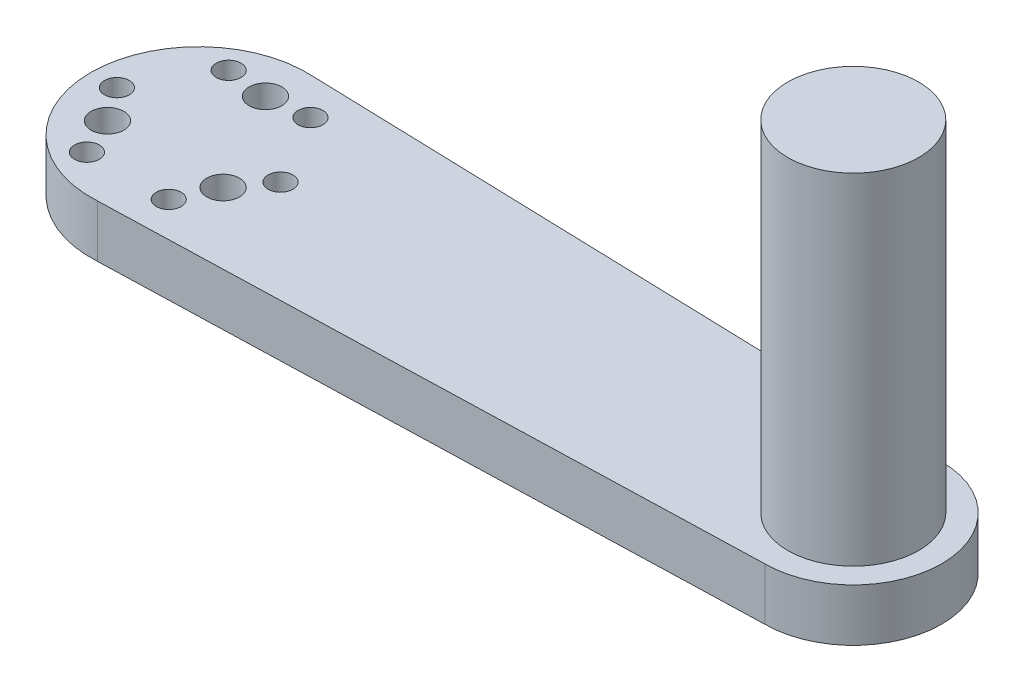
ISO-10303-21;
HEADER;
FILE_DESCRIPTION(('STEP AP214'),'2;1');
FILE_NAME('part.step','',(''),(''),'','','');
FILE_SCHEMA(('AUTOMOTIVE_DESIGN { 1 0 10303 214 1 1 1 1 }'));
ENDSEC;
DATA;
#1=APPLICATION_CONTEXT('core data for automotive mechanical design processes');
#2=APPLICATION_PROTOCOL_DEFINITION('international standard','automotive_design',2000,#1);
#3=PRODUCT_CONTEXT('',#1,'mechanical');
#4=PRODUCT('Part','Part','',(#3));
#5=PRODUCT_RELATED_PRODUCT_CATEGORY('part','',(#4));
#6=PRODUCT_DEFINITION_FORMATION('','',#4);
#7=PRODUCT_DEFINITION_CONTEXT('part definition',#1,'design');
#8=PRODUCT_DEFINITION('design','',#6,#7);
#9=PRODUCT_DEFINITION_SHAPE('','',#8);
#10=(LENGTH_UNIT() NAMED_UNIT(*) SI_UNIT(.MILLI.,.METRE.));
#11=(NAMED_UNIT(*) PLANE_ANGLE_UNIT() SI_UNIT($,.RADIAN.));
#12=(NAMED_UNIT(*) SI_UNIT($,.STERADIAN.) SOLID_ANGLE_UNIT());
#13=UNCERTAINTY_MEASURE_WITH_UNIT(LENGTH_MEASURE(1.E-05),#10,'distance_accuracy_value','');
#14=(GEOMETRIC_REPRESENTATION_CONTEXT(3) GLOBAL_UNCERTAINTY_ASSIGNED_CONTEXT((#13)) GLOBAL_UNIT_ASSIGNED_CONTEXT((#10,
#11,#12)) REPRESENTATION_CONTEXT('',''));
#15=CARTESIAN_POINT('',(0.,0.,0.));
#16=DIRECTION('',(0.,0.,1.));
#17=DIRECTION('',(1.,0.,0.));
#18=AXIS2_PLACEMENT_3D('',#15,#16,#17);
#19=CARTESIAN_POINT('',(0.,8.,0.));
#20=DIRECTION('',(0.,-1.,0.));
#21=DIRECTION('',(0.,0.,-1.));
#22=AXIS2_PLACEMENT_3D('',#19,#20,#21);
#23=CYLINDRICAL_SURFACE('',#22,16.5);
#24=CARTESIAN_POINT('',(0.,0.,0.));
#25=DIRECTION('',(0.,1.,0.));
#26=DIRECTION('',(0.,0.,1.));
#27=AXIS2_PLACEMENT_3D('',#24,#25,#26);
#28=CIRCLE('',#27,16.5);
#29=CARTESIAN_POINT('',(0.98910980117891,0.,-16.4703267059646));
#30=VERTEX_POINT('',#29);
#31=CARTESIAN_POINT('',(0.989109801178909,0.,16.4703267059646));
#32=VERTEX_POINT('',#31);
#33=EDGE_CURVE('E46',#30,#32,#28,.T.);
#34=ORIENTED_EDGE('',*,*,#33,.T.);
#35=DIRECTION('',(0.,-1.,0.));
#36=VECTOR('',#35,1.);
#37=CARTESIAN_POINT('',(0.98910980117891,8.,16.4703267059646));
#38=LINE('',#37,#36);
#39=CARTESIAN_POINT('',(0.989109801178909,8.,16.4703267059646));
#40=VERTEX_POINT('',#39);
#41=EDGE_CURVE('E60',#40,#32,#38,.T.);
#42=ORIENTED_EDGE('',*,*,#41,.F.);
#43=CARTESIAN_POINT('',(0.,8.,0.));
#44=DIRECTION('',(0.,1.,0.));
#45=DIRECTION('',(0.,0.,1.));
#46=AXIS2_PLACEMENT_3D('',#43,#44,#45);
#47=CIRCLE('',#46,16.5);
#48=CARTESIAN_POINT('',(0.989109801178909,8.,-16.4703267059646));
#49=VERTEX_POINT('',#48);
#50=EDGE_CURVE('E11',#49,#40,#47,.T.);
#51=ORIENTED_EDGE('',*,*,#50,.F.);
#52=DIRECTION('',(0.,-1.,0.));
#53=VECTOR('',#52,1.);
#54=CARTESIAN_POINT('',(0.98910980117891,8.,-16.4703267059646));
#55=LINE('',#54,#53);
#56=EDGE_CURVE('E117',#49,#30,#55,.T.);
#57=ORIENTED_EDGE('',*,*,#56,.T.);
#58=EDGE_LOOP('',(#34,#42,#51,#57));
#59=FACE_BOUND('',#58,.T.);
#60=ADVANCED_FACE('F43',(#59),#23,.T.);
#61=CARTESIAN_POINT('',(0.,8.,0.));
#62=DIRECTION('',(0.,1.,0.));
#63=DIRECTION('',(0.,0.,1.));
#64=AXIS2_PLACEMENT_3D('',#61,#62,#63);
#65=PLANE('',#64);
#66=CARTESIAN_POINT('',(6.25000000000001,8.,-10.8253175473055));
#67=DIRECTION('',(0.,1.,0.));
#68=DIRECTION('',(0.,0.,1.));
#69=AXIS2_PLACEMENT_3D('',#66,#67,#68);
#70=CIRCLE('',#69,1.9);
#71=CARTESIAN_POINT('',(6.25000000000001,8.,-8.92531754730548));
#72=VERTEX_POINT('',#71);
#73=EDGE_CURVE('E170',#72,#72,#70,.T.);
#74=ORIENTED_EDGE('',*,*,#73,.F.);
#75=EDGE_LOOP('',(#74));
#76=FACE_BOUND('',#75,.T.);
#77=CARTESIAN_POINT('',(12.5,8.,0.));
#78=DIRECTION('',(0.,1.,0.));
#79=DIRECTION('',(0.,0.,1.));
#80=AXIS2_PLACEMENT_3D('',#77,#78,#79);
#81=CIRCLE('',#80,1.9);
#82=CARTESIAN_POINT('',(12.5,8.,1.90000000000004));
#83=VERTEX_POINT('',#82);
#84=EDGE_CURVE('E167',#83,#83,#81,.T.);
#85=ORIENTED_EDGE('',*,*,#84,.F.);
#86=EDGE_LOOP('',(#85));
#87=FACE_BOUND('',#86,.T.);
#88=CARTESIAN_POINT('',(8.83345911860192,8.,5.09999999999962));
#89=DIRECTION('',(0.,1.,0.));
#90=DIRECTION('',(0.,0.,1.));
#91=AXIS2_PLACEMENT_3D('',#88,#89,#90);
#92=CIRCLE('',#91,2.5);
#93=CARTESIAN_POINT('',(8.83345911860192,8.,7.59999999999962));
#94=VERTEX_POINT('',#93);
#95=EDGE_CURVE('E164',#94,#94,#92,.T.);
#96=ORIENTED_EDGE('',*,*,#95,.F.);
#97=EDGE_LOOP('',(#96));
#98=FACE_BOUND('',#97,.T.);
#99=CARTESIAN_POINT('',(6.24999999999994,8.,10.8253175473055));
#100=DIRECTION('',(0.,1.,0.));
#101=DIRECTION('',(0.,0.,1.));
#102=AXIS2_PLACEMENT_3D('',#99,#100,#101);
#103=CIRCLE('',#102,1.9);
#104=CARTESIAN_POINT('',(6.24999999999994,8.,12.7253175473055));
#105=VERTEX_POINT('',#104);
#106=EDGE_CURVE('E161',#105,#105,#103,.T.);
#107=ORIENTED_EDGE('',*,*,#106,.F.);
#108=EDGE_LOOP('',(#107));
#109=FACE_BOUND('',#108,.T.);
#110=CARTESIAN_POINT('',(-6.25000000000009,8.,10.8253175473054));
#111=DIRECTION('',(0.,1.,0.));
#112=DIRECTION('',(0.,0.,1.));
#113=AXIS2_PLACEMENT_3D('',#110,#111,#112);
#114=CIRCLE('',#113,1.9);
#115=CARTESIAN_POINT('',(-6.25000000000009,8.,12.7253175473054));
#116=VERTEX_POINT('',#115);
#117=EDGE_CURVE('E158',#116,#116,#114,.T.);
#118=ORIENTED_EDGE('',*,*,#117,.F.);
#119=EDGE_LOOP('',(#118));
#120=FACE_BOUND('',#119,.T.);
#121=CARTESIAN_POINT('',(-8.83345911860063,8.,5.10000000000037));
#122=DIRECTION('',(0.,1.,0.));
#123=DIRECTION('',(0.,0.,1.));
#124=AXIS2_PLACEMENT_3D('',#121,#122,#123);
#125=CIRCLE('',#124,2.5);
#126=CARTESIAN_POINT('',(-8.83345911860063,8.,7.60000000000037));
#127=VERTEX_POINT('',#126);
#128=EDGE_CURVE('E155',#127,#127,#125,.T.);
#129=ORIENTED_EDGE('',*,*,#128,.F.);
#130=EDGE_LOOP('',(#129));
#131=FACE_BOUND('',#130,.T.);
#132=CARTESIAN_POINT('',(0.,8.,-10.2));
#133=DIRECTION('',(0.,1.,0.));
#134=DIRECTION('',(0.,0.,1.));
#135=AXIS2_PLACEMENT_3D('',#132,#133,#134);
#136=CIRCLE('',#135,2.5);
#137=CARTESIAN_POINT('',(0.,8.,-7.7));
#138=VERTEX_POINT('',#137);
#139=EDGE_CURVE('E152',#138,#138,#136,.T.);
#140=ORIENTED_EDGE('',*,*,#139,.F.);
#141=EDGE_LOOP('',(#140));
#142=FACE_BOUND('',#141,.T.);
#143=CARTESIAN_POINT('',(-6.25000000000002,8.,-10.8253175473055));
#144=DIRECTION('',(0.,1.,0.));
#145=DIRECTION('',(0.,0.,1.));
#146=AXIS2_PLACEMENT_3D('',#143,#144,#145);
#147=CIRCLE('',#146,1.9);
#148=CARTESIAN_POINT('',(-6.25000000000002,8.,-8.92531754730548));
#149=VERTEX_POINT('',#148);
#150=EDGE_CURVE('E149',#149,#149,#147,.T.);
#151=ORIENTED_EDGE('',*,*,#150,.F.);
#152=EDGE_LOOP('',(#151));
#153=FACE_BOUND('',#152,.T.);
#154=CARTESIAN_POINT('',(-12.5,8.,-1.27502175484295E-13));
#155=DIRECTION('',(0.,1.,0.));
#156=DIRECTION('',(0.,0.,1.));
#157=AXIS2_PLACEMENT_3D('',#154,#155,#156);
#158=CIRCLE('',#157,1.9);
#159=CARTESIAN_POINT('',(-12.5,8.,1.89999999999987));
#160=VERTEX_POINT('',#159);
#161=EDGE_CURVE('E146',#160,#160,#158,.T.);
#162=ORIENTED_EDGE('',*,*,#161,.F.);
#163=EDGE_LOOP('',(#162));
#164=FACE_BOUND('',#163,.T.);
#165=ORIENTED_EDGE('',*,*,#50,.T.);
#166=DIRECTION('',(-0.999550303522367,0.,0.029986509105671));
#167=VECTOR('',#166,1.);
#168=CARTESIAN_POINT('',(0.49455490058947,8.,16.4851633529823));
#169=LINE('',#168,#167);
#170=CARTESIAN_POINT('',(100.,8.,13.5));
#171=VERTEX_POINT('',#170);
#172=EDGE_CURVE('E84',#171,#40,#169,.T.);
#173=ORIENTED_EDGE('',*,*,#172,.F.);
#174=CARTESIAN_POINT('',(100.,8.,0.));
#175=DIRECTION('',(0.,1.,0.));
#176=DIRECTION('',(0.,0.,1.));
#177=AXIS2_PLACEMENT_3D('',#174,#175,#176);
#178=CIRCLE('',#177,13.5);
#179=CARTESIAN_POINT('',(100.,8.,-13.5));
#180=VERTEX_POINT('',#179);
#181=EDGE_CURVE('E93',#171,#180,#178,.T.);
#182=ORIENTED_EDGE('',*,*,#181,.T.);
#183=DIRECTION('',(-0.999550303522367,0.,-0.029986509105671));
#184=VECTOR('',#183,1.);
#185=CARTESIAN_POINT('',(0.49455490058947,8.,-16.4851633529823));
#186=LINE('',#185,#184);
#187=EDGE_CURVE('E98',#180,#49,#186,.T.);
#188=ORIENTED_EDGE('',*,*,#187,.T.);
#189=EDGE_LOOP('',(#165,#173,#182,#188));
#190=FACE_BOUND('',#189,.T.);
#191=CARTESIAN_POINT('',(100.,8.,0.));
#192=DIRECTION('',(0.,1.,0.));
#193=DIRECTION('',(0.,0.,1.));
#194=AXIS2_PLACEMENT_3D('',#191,#192,#193);
#195=CIRCLE('',#194,10.);
#196=CARTESIAN_POINT('',(100.,8.,10.));
#197=VERTEX_POINT('',#196);
#198=EDGE_CURVE('E111',#197,#197,#195,.T.);
#199=ORIENTED_EDGE('',*,*,#198,.F.);
#200=EDGE_LOOP('',(#199));
#201=FACE_BOUND('',#200,.T.);
#202=ADVANCED_FACE('F100',(#76,#87,#98,#109,#120,#131,#142,#153,#164,#190,#201),#65,.T.);
#203=CARTESIAN_POINT('',(0.,0.,0.));
#204=DIRECTION('',(0.,1.,0.));
#205=DIRECTION('',(0.,0.,1.));
#206=AXIS2_PLACEMENT_3D('',#203,#204,#205);
#207=PLANE('',#206);
#208=CARTESIAN_POINT('',(6.25000000000001,0.,-10.8253175473055));
#209=DIRECTION('',(0.,1.,0.));
#210=DIRECTION('',(0.,0.,1.));
#211=AXIS2_PLACEMENT_3D('',#208,#209,#210);
#212=CIRCLE('',#211,1.9);
#213=CARTESIAN_POINT('',(6.25000000000001,0.,-8.92531754730548));
#214=VERTEX_POINT('',#213);
#215=EDGE_CURVE('E89',#214,#214,#212,.T.);
#216=ORIENTED_EDGE('',*,*,#215,.T.);
#217=EDGE_LOOP('',(#216));
#218=FACE_BOUND('',#217,.T.);
#219=CARTESIAN_POINT('',(12.5,0.,0.));
#220=DIRECTION('',(0.,1.,0.));
#221=DIRECTION('',(0.,0.,1.));
#222=AXIS2_PLACEMENT_3D('',#219,#220,#221);
#223=CIRCLE('',#222,1.9);
#224=CARTESIAN_POINT('',(12.5,0.,1.90000000000004));
#225=VERTEX_POINT('',#224);
#226=EDGE_CURVE('E139',#225,#225,#223,.T.);
#227=ORIENTED_EDGE('',*,*,#226,.T.);
#228=EDGE_LOOP('',(#227));
#229=FACE_BOUND('',#228,.T.);
#230=CARTESIAN_POINT('',(8.83345911860192,0.,5.09999999999962));
#231=DIRECTION('',(0.,1.,0.));
#232=DIRECTION('',(0.,0.,1.));
#233=AXIS2_PLACEMENT_3D('',#230,#231,#232);
#234=CIRCLE('',#233,2.5);
#235=CARTESIAN_POINT('',(8.83345911860192,0.,7.59999999999962));
#236=VERTEX_POINT('',#235);
#237=EDGE_CURVE('E136',#236,#236,#234,.T.);
#238=ORIENTED_EDGE('',*,*,#237,.T.);
#239=EDGE_LOOP('',(#238));
#240=FACE_BOUND('',#239,.T.);
#241=CARTESIAN_POINT('',(6.24999999999994,0.,10.8253175473055));
#242=DIRECTION('',(0.,1.,0.));
#243=DIRECTION('',(0.,0.,1.));
#244=AXIS2_PLACEMENT_3D('',#241,#242,#243);
#245=CIRCLE('',#244,1.9);
#246=CARTESIAN_POINT('',(6.24999999999994,0.,12.7253175473055));
#247=VERTEX_POINT('',#246);
#248=EDGE_CURVE('E133',#247,#247,#245,.T.);
#249=ORIENTED_EDGE('',*,*,#248,.T.);
#250=EDGE_LOOP('',(#249));
#251=FACE_BOUND('',#250,.T.);
#252=CARTESIAN_POINT('',(-6.25000000000009,0.,10.8253175473054));
#253=DIRECTION('',(0.,1.,0.));
#254=DIRECTION('',(0.,0.,1.));
#255=AXIS2_PLACEMENT_3D('',#252,#253,#254);
#256=CIRCLE('',#255,1.9);
#257=CARTESIAN_POINT('',(-6.25000000000009,0.,12.7253175473054));
#258=VERTEX_POINT('',#257);
#259=EDGE_CURVE('E130',#258,#258,#256,.T.);
#260=ORIENTED_EDGE('',*,*,#259,.T.);
#261=EDGE_LOOP('',(#260));
#262=FACE_BOUND('',#261,.T.);
#263=CARTESIAN_POINT('',(-8.83345911860063,0.,5.10000000000037));
#264=DIRECTION('',(0.,1.,0.));
#265=DIRECTION('',(0.,0.,1.));
#266=AXIS2_PLACEMENT_3D('',#263,#264,#265);
#267=CIRCLE('',#266,2.5);
#268=CARTESIAN_POINT('',(-8.83345911860063,0.,7.60000000000037));
#269=VERTEX_POINT('',#268);
#270=EDGE_CURVE('E127',#269,#269,#267,.T.);
#271=ORIENTED_EDGE('',*,*,#270,.T.);
#272=EDGE_LOOP('',(#271));
#273=FACE_BOUND('',#272,.T.);
#274=CARTESIAN_POINT('',(0.,0.,-10.2));
#275=DIRECTION('',(0.,1.,0.));
#276=DIRECTION('',(0.,0.,1.));
#277=AXIS2_PLACEMENT_3D('',#274,#275,#276);
#278=CIRCLE('',#277,2.5);
#279=CARTESIAN_POINT('',(0.,0.,-7.7));
#280=VERTEX_POINT('',#279);
#281=EDGE_CURVE('E124',#280,#280,#278,.T.);
#282=ORIENTED_EDGE('',*,*,#281,.T.);
#283=EDGE_LOOP('',(#282));
#284=FACE_BOUND('',#283,.T.);
#285=CARTESIAN_POINT('',(-6.25000000000002,0.,-10.8253175473055));
#286=DIRECTION('',(0.,1.,0.));
#287=DIRECTION('',(0.,0.,1.));
#288=AXIS2_PLACEMENT_3D('',#285,#286,#287);
#289=CIRCLE('',#288,1.9);
#290=CARTESIAN_POINT('',(-6.25000000000002,0.,-8.92531754730548));
#291=VERTEX_POINT('',#290);
#292=EDGE_CURVE('E120',#291,#291,#289,.T.);
#293=ORIENTED_EDGE('',*,*,#292,.T.);
#294=EDGE_LOOP('',(#293));
#295=FACE_BOUND('',#294,.T.);
#296=CARTESIAN_POINT('',(-12.5,0.,-1.27502175484295E-13));
#297=DIRECTION('',(0.,1.,0.));
#298=DIRECTION('',(0.,0.,1.));
#299=AXIS2_PLACEMENT_3D('',#296,#297,#298);
#300=CIRCLE('',#299,1.9);
#301=CARTESIAN_POINT('',(-12.5,0.,1.89999999999987));
#302=VERTEX_POINT('',#301);
#303=EDGE_CURVE('E123',#302,#302,#300,.T.);
#304=ORIENTED_EDGE('',*,*,#303,.T.);
#305=EDGE_LOOP('',(#304));
#306=FACE_BOUND('',#305,.T.);
#307=ORIENTED_EDGE('',*,*,#33,.F.);
#308=DIRECTION('',(-0.999550303522367,0.,-0.029986509105671));
#309=VECTOR('',#308,1.);
#310=CARTESIAN_POINT('',(0.49455490058947,0.,-16.4851633529823));
#311=LINE('',#310,#309);
#312=CARTESIAN_POINT('',(100.,0.,-13.5));
#313=VERTEX_POINT('',#312);
#314=EDGE_CURVE('E102',#313,#30,#311,.T.);
#315=ORIENTED_EDGE('',*,*,#314,.F.);
#316=CARTESIAN_POINT('',(100.,0.,0.));
#317=DIRECTION('',(0.,1.,0.));
#318=DIRECTION('',(0.,0.,1.));
#319=AXIS2_PLACEMENT_3D('',#316,#317,#318);
#320=CIRCLE('',#319,13.5);
#321=CARTESIAN_POINT('',(100.,0.,13.5));
#322=VERTEX_POINT('',#321);
#323=EDGE_CURVE('E105',#322,#313,#320,.T.);
#324=ORIENTED_EDGE('',*,*,#323,.F.);
#325=DIRECTION('',(-0.999550303522367,0.,0.029986509105671));
#326=VECTOR('',#325,1.);
#327=CARTESIAN_POINT('',(0.49455490058947,0.,16.4851633529823));
#328=LINE('',#327,#326);
#329=EDGE_CURVE('E86',#322,#32,#328,.T.);
#330=ORIENTED_EDGE('',*,*,#329,.T.);
#331=EDGE_LOOP('',(#307,#315,#324,#330));
#332=FACE_BOUND('',#331,.T.);
#333=ADVANCED_FACE('F177',(#218,#229,#240,#251,#262,#273,#284,#295,#306,#332),#207,.F.);
#334=CARTESIAN_POINT('',(-12.5,0.,-1.27502175484295E-13));
#335=DIRECTION('',(0.,1.,0.));
#336=DIRECTION('',(0.,0.,1.));
#337=AXIS2_PLACEMENT_3D('',#334,#335,#336);
#338=CYLINDRICAL_SURFACE('',#337,1.9);
#339=ORIENTED_EDGE('',*,*,#161,.T.);
#340=EDGE_LOOP('',(#339));
#341=FACE_BOUND('',#340,.T.);
#342=ORIENTED_EDGE('',*,*,#303,.F.);
#343=EDGE_LOOP('',(#342));
#344=FACE_BOUND('',#343,.T.);
#345=ADVANCED_FACE('F202',(#341,#344),#338,.F.);
#346=CARTESIAN_POINT('',(-6.25000000000002,0.,-10.8253175473055));
#347=DIRECTION('',(0.,1.,0.));
#348=DIRECTION('',(0.,0.,1.));
#349=AXIS2_PLACEMENT_3D('',#346,#347,#348);
#350=CYLINDRICAL_SURFACE('',#349,1.9);
#351=ORIENTED_EDGE('',*,*,#150,.T.);
#352=EDGE_LOOP('',(#351));
#353=FACE_BOUND('',#352,.T.);
#354=ORIENTED_EDGE('',*,*,#292,.F.);
#355=EDGE_LOOP('',(#354));
#356=FACE_BOUND('',#355,.T.);
#357=ADVANCED_FACE('F208',(#353,#356),#350,.F.);
#358=CARTESIAN_POINT('',(0.,0.,-10.2));
#359=DIRECTION('',(0.,1.,0.));
#360=DIRECTION('',(0.,0.,1.));
#361=AXIS2_PLACEMENT_3D('',#358,#359,#360);
#362=CYLINDRICAL_SURFACE('',#361,2.5);
#363=ORIENTED_EDGE('',*,*,#139,.T.);
#364=EDGE_LOOP('',(#363));
#365=FACE_BOUND('',#364,.T.);
#366=ORIENTED_EDGE('',*,*,#281,.F.);
#367=EDGE_LOOP('',(#366));
#368=FACE_BOUND('',#367,.T.);
#369=ADVANCED_FACE('F231',(#365,#368),#362,.F.);
#370=CARTESIAN_POINT('',(-8.83345911860063,0.,5.10000000000037));
#371=DIRECTION('',(0.,1.,0.));
#372=DIRECTION('',(0.,0.,1.));
#373=AXIS2_PLACEMENT_3D('',#370,#371,#372);
#374=CYLINDRICAL_SURFACE('',#373,2.5);
#375=ORIENTED_EDGE('',*,*,#128,.T.);
#376=EDGE_LOOP('',(#375));
#377=FACE_BOUND('',#376,.T.);
#378=ORIENTED_EDGE('',*,*,#270,.F.);
#379=EDGE_LOOP('',(#378));
#380=FACE_BOUND('',#379,.T.);
#381=ADVANCED_FACE('F227',(#377,#380),#374,.F.);
#382=CARTESIAN_POINT('',(-6.25000000000009,0.,10.8253175473054));
#383=DIRECTION('',(0.,1.,0.));
#384=DIRECTION('',(0.,0.,1.));
#385=AXIS2_PLACEMENT_3D('',#382,#383,#384);
#386=CYLINDRICAL_SURFACE('',#385,1.9);
#387=ORIENTED_EDGE('',*,*,#117,.T.);
#388=EDGE_LOOP('',(#387));
#389=FACE_BOUND('',#388,.T.);
#390=ORIENTED_EDGE('',*,*,#259,.F.);
#391=EDGE_LOOP('',(#390));
#392=FACE_BOUND('',#391,.T.);
#393=ADVANCED_FACE('F223',(#389,#392),#386,.F.);
#394=CARTESIAN_POINT('',(6.24999999999994,0.,10.8253175473055));
#395=DIRECTION('',(0.,1.,0.));
#396=DIRECTION('',(0.,0.,1.));
#397=AXIS2_PLACEMENT_3D('',#394,#395,#396);
#398=CYLINDRICAL_SURFACE('',#397,1.9);
#399=ORIENTED_EDGE('',*,*,#106,.T.);
#400=EDGE_LOOP('',(#399));
#401=FACE_BOUND('',#400,.T.);
#402=ORIENTED_EDGE('',*,*,#248,.F.);
#403=EDGE_LOOP('',(#402));
#404=FACE_BOUND('',#403,.T.);
#405=ADVANCED_FACE('F219',(#401,#404),#398,.F.);
#406=CARTESIAN_POINT('',(8.83345911860192,0.,5.09999999999962));
#407=DIRECTION('',(0.,1.,0.));
#408=DIRECTION('',(0.,0.,1.));
#409=AXIS2_PLACEMENT_3D('',#406,#407,#408);
#410=CYLINDRICAL_SURFACE('',#409,2.5);
#411=ORIENTED_EDGE('',*,*,#95,.T.);
#412=EDGE_LOOP('',(#411));
#413=FACE_BOUND('',#412,.T.);
#414=ORIENTED_EDGE('',*,*,#237,.F.);
#415=EDGE_LOOP('',(#414));
#416=FACE_BOUND('',#415,.T.);
#417=ADVANCED_FACE('F215',(#413,#416),#410,.F.);
#418=CARTESIAN_POINT('',(12.5,0.,0.));
#419=DIRECTION('',(0.,1.,0.));
#420=DIRECTION('',(0.,0.,1.));
#421=AXIS2_PLACEMENT_3D('',#418,#419,#420);
#422=CYLINDRICAL_SURFACE('',#421,1.9);
#423=ORIENTED_EDGE('',*,*,#84,.T.);
#424=EDGE_LOOP('',(#423));
#425=FACE_BOUND('',#424,.T.);
#426=ORIENTED_EDGE('',*,*,#226,.F.);
#427=EDGE_LOOP('',(#426));
#428=FACE_BOUND('',#427,.T.);
#429=ADVANCED_FACE('F212',(#425,#428),#422,.F.);
#430=CARTESIAN_POINT('',(6.25000000000001,0.,-10.8253175473055));
#431=DIRECTION('',(0.,1.,0.));
#432=DIRECTION('',(0.,0.,1.));
#433=AXIS2_PLACEMENT_3D('',#430,#431,#432);
#434=CYLINDRICAL_SURFACE('',#433,1.9);
#435=ORIENTED_EDGE('',*,*,#73,.T.);
#436=EDGE_LOOP('',(#435));
#437=FACE_BOUND('',#436,.T.);
#438=ORIENTED_EDGE('',*,*,#215,.F.);
#439=EDGE_LOOP('',(#438));
#440=FACE_BOUND('',#439,.T.);
#441=ADVANCED_FACE('F210',(#437,#440),#434,.F.);
#442=CARTESIAN_POINT('',(0.49455490058947,8.,16.4851633529823));
#443=DIRECTION('',(0.029986509105671,0.,0.999550303522367));
#444=DIRECTION('',(0.999550303522367,0.,-0.029986509105671));
#445=AXIS2_PLACEMENT_3D('',#442,#443,#444);
#446=PLANE('',#445);
#447=ORIENTED_EDGE('',*,*,#329,.F.);
#448=DIRECTION('',(0.,-1.,0.));
#449=VECTOR('',#448,1.);
#450=CARTESIAN_POINT('',(100.,8.,13.5));
#451=LINE('',#450,#449);
#452=EDGE_CURVE('E80',#171,#322,#451,.T.);
#453=ORIENTED_EDGE('',*,*,#452,.F.);
#454=ORIENTED_EDGE('',*,*,#172,.T.);
#455=ORIENTED_EDGE('',*,*,#41,.T.);
#456=EDGE_LOOP('',(#447,#453,#454,#455));
#457=FACE_BOUND('',#456,.T.);
#458=ADVANCED_FACE('F82',(#457),#446,.T.);
#459=CARTESIAN_POINT('',(100.,8.,0.));
#460=DIRECTION('',(0.,-1.,0.));
#461=DIRECTION('',(0.,0.,-1.));
#462=AXIS2_PLACEMENT_3D('',#459,#460,#461);
#463=CYLINDRICAL_SURFACE('',#462,13.5);
#464=ORIENTED_EDGE('',*,*,#323,.T.);
#465=DIRECTION('',(0.,-1.,0.));
#466=VECTOR('',#465,1.);
#467=CARTESIAN_POINT('',(100.,8.,-13.5));
#468=LINE('',#467,#466);
#469=EDGE_CURVE('E90',#180,#313,#468,.T.);
#470=ORIENTED_EDGE('',*,*,#469,.F.);
#471=ORIENTED_EDGE('',*,*,#181,.F.);
#472=ORIENTED_EDGE('',*,*,#452,.T.);
#473=EDGE_LOOP('',(#464,#470,#471,#472));
#474=FACE_BOUND('',#473,.T.);
#475=ADVANCED_FACE('F94',(#474),#463,.T.);
#476=CARTESIAN_POINT('',(0.49455490058947,8.,-16.4851633529823));
#477=DIRECTION('',(-0.029986509105671,0.,0.999550303522367));
#478=DIRECTION('',(0.999550303522367,0.,0.029986509105671));
#479=AXIS2_PLACEMENT_3D('',#476,#477,#478);
#480=PLANE('',#479);
#481=ORIENTED_EDGE('',*,*,#314,.T.);
#482=ORIENTED_EDGE('',*,*,#56,.F.);
#483=ORIENTED_EDGE('',*,*,#187,.F.);
#484=ORIENTED_EDGE('',*,*,#469,.T.);
#485=EDGE_LOOP('',(#481,#482,#483,#484));
#486=FACE_BOUND('',#485,.T.);
#487=ADVANCED_FACE('F179',(#486),#480,.F.);
#488=CARTESIAN_POINT('',(100.,60.,0.));
#489=DIRECTION('',(0.,-1.,0.));
#490=DIRECTION('',(0.,0.,-1.));
#491=AXIS2_PLACEMENT_3D('',#488,#489,#490);
#492=CYLINDRICAL_SURFACE('',#491,10.);
#493=ORIENTED_EDGE('',*,*,#198,.T.);
#494=EDGE_LOOP('',(#493));
#495=FACE_BOUND('',#494,.T.);
#496=CARTESIAN_POINT('',(100.,60.,0.));
#497=DIRECTION('',(0.,1.,0.));
#498=DIRECTION('',(0.,0.,1.));
#499=AXIS2_PLACEMENT_3D('',#496,#497,#498);
#500=CIRCLE('',#499,10.);
#501=CARTESIAN_POINT('',(100.,60.,10.));
#502=VERTEX_POINT('',#501);
#503=EDGE_CURVE('E108',#502,#502,#500,.T.);
#504=ORIENTED_EDGE('',*,*,#503,.F.);
#505=EDGE_LOOP('',(#504));
#506=FACE_BOUND('',#505,.T.);
#507=ADVANCED_FACE('F181',(#495,#506),#492,.T.);
#508=CARTESIAN_POINT('',(0.,60.,0.));
#509=DIRECTION('',(0.,1.,0.));
#510=DIRECTION('',(0.,0.,1.));
#511=AXIS2_PLACEMENT_3D('',#508,#509,#510);
#512=PLANE('',#511);
#513=ORIENTED_EDGE('',*,*,#503,.T.);
#514=EDGE_LOOP('',(#513));
#515=FACE_BOUND('',#514,.T.);
#516=ADVANCED_FACE('F188',(#515),#512,.T.);
#517=CLOSED_SHELL('',(#60,#202,#333,#345,#357,#369,#381,#393,#405,#417,#429,#441,#458,#475,#487,
#507,#516));
#518=MANIFOLD_SOLID_BREP('B2',#517);
#519=ADVANCED_BREP_SHAPE_REPRESENTATION('',(#18,#518),#14);
#520=SHAPE_DEFINITION_REPRESENTATION(#9,#519);
ENDSEC;
END-ISO-10303-21;
